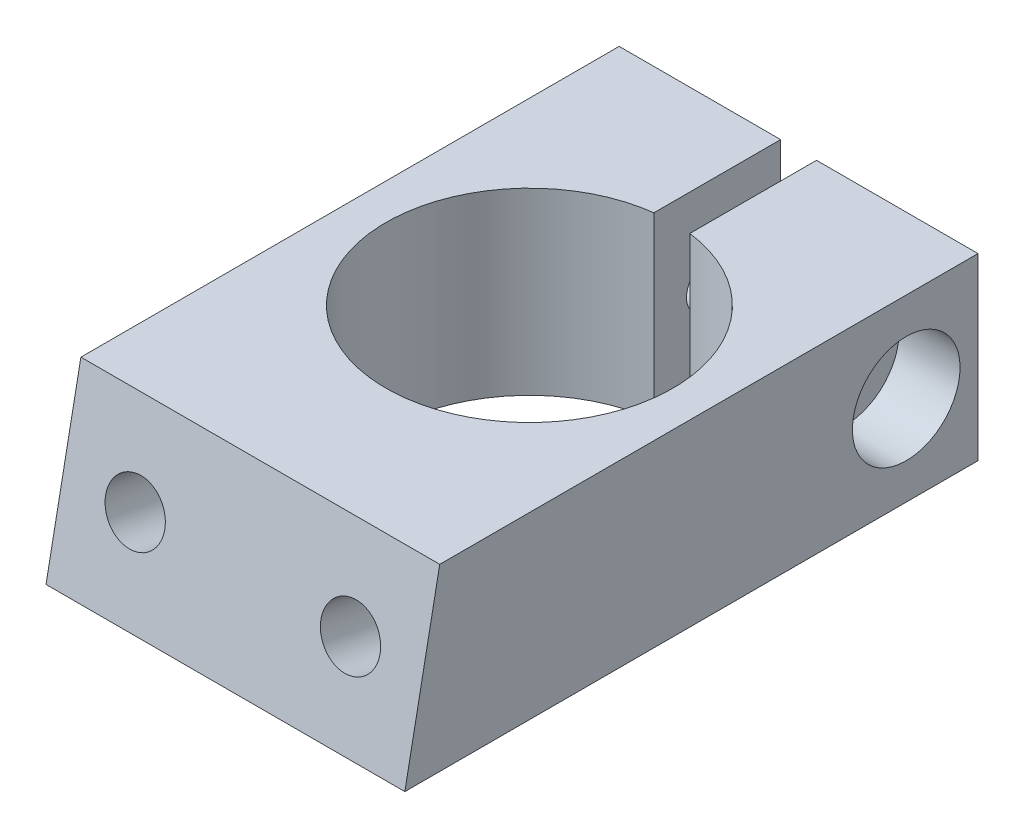
ISO-10303-21;
HEADER;
FILE_DESCRIPTION(('STEP AP214'),'2;1');
FILE_NAME('part.step','',(''),(''),'','','');
FILE_SCHEMA(('AUTOMOTIVE_DESIGN { 1 0 10303 214 1 1 1 1 }'));
ENDSEC;
DATA;
#1=APPLICATION_CONTEXT('core data for automotive mechanical design processes');
#2=APPLICATION_PROTOCOL_DEFINITION('international standard','automotive_design',2000,#1);
#3=PRODUCT_CONTEXT('',#1,'mechanical');
#4=PRODUCT('Part','Part','',(#3));
#5=PRODUCT_RELATED_PRODUCT_CATEGORY('part','',(#4));
#6=PRODUCT_DEFINITION_FORMATION('','',#4);
#7=PRODUCT_DEFINITION_CONTEXT('part definition',#1,'design');
#8=PRODUCT_DEFINITION('design','',#6,#7);
#9=PRODUCT_DEFINITION_SHAPE('','',#8);
#10=(LENGTH_UNIT() NAMED_UNIT(*) SI_UNIT(.MILLI.,.METRE.));
#11=(NAMED_UNIT(*) PLANE_ANGLE_UNIT() SI_UNIT($,.RADIAN.));
#12=(NAMED_UNIT(*) SI_UNIT($,.STERADIAN.) SOLID_ANGLE_UNIT());
#13=UNCERTAINTY_MEASURE_WITH_UNIT(LENGTH_MEASURE(1.E-05),#10,'distance_accuracy_value','');
#14=(GEOMETRIC_REPRESENTATION_CONTEXT(3) GLOBAL_UNCERTAINTY_ASSIGNED_CONTEXT((#13)) GLOBAL_UNIT_ASSIGNED_CONTEXT((#10,
#11,#12)) REPRESENTATION_CONTEXT('',''));
#15=CARTESIAN_POINT('',(0.,0.,0.));
#16=DIRECTION('',(0.,0.,1.));
#17=DIRECTION('',(1.,0.,0.));
#18=AXIS2_PLACEMENT_3D('',#15,#16,#17);
#19=CARTESIAN_POINT('',(10.,0.,-31.9438030913771));
#20=DIRECTION('',(0.,0.,1.));
#21=DIRECTION('',(1.,0.,0.));
#22=AXIS2_PLACEMENT_3D('',#19,#20,#21);
#23=PLANE('',#22);
#24=DIRECTION('',(-1.,0.,0.));
#25=VECTOR('',#24,1.);
#26=CARTESIAN_POINT('',(10.,10.,-31.9438030913771));
#27=LINE('',#26,#25);
#28=CARTESIAN_POINT('',(-1.,10.,-31.9438030913771));
#29=VERTEX_POINT('',#28);
#30=CARTESIAN_POINT('',(-10.,10.,-31.9438030913771));
#31=VERTEX_POINT('',#30);
#32=EDGE_CURVE('E251',#29,#31,#27,.T.);
#33=ORIENTED_EDGE('',*,*,#32,.F.);
#34=DIRECTION('',(0.,1.,0.));
#35=VECTOR('',#34,1.);
#36=CARTESIAN_POINT('',(-1.,0.,-31.9438030913771));
#37=LINE('',#36,#35);
#38=CARTESIAN_POINT('',(-1.,0.,-31.9438030913771));
#39=VERTEX_POINT('',#38);
#40=EDGE_CURVE('E226',#39,#29,#37,.T.);
#41=ORIENTED_EDGE('',*,*,#40,.F.);
#42=DIRECTION('',(-1.,0.,0.));
#43=VECTOR('',#42,1.);
#44=CARTESIAN_POINT('',(10.,0.,-31.9438030913771));
#45=LINE('',#44,#43);
#46=CARTESIAN_POINT('',(-10.,0.,-31.9438030913771));
#47=VERTEX_POINT('',#46);
#48=EDGE_CURVE('E167',#39,#47,#45,.T.);
#49=ORIENTED_EDGE('',*,*,#48,.T.);
#50=DIRECTION('',(0.,1.,0.));
#51=VECTOR('',#50,1.);
#52=CARTESIAN_POINT('',(-10.,0.,-31.9438030913771));
#53=LINE('',#52,#51);
#54=EDGE_CURVE('E242',#47,#31,#53,.T.);
#55=ORIENTED_EDGE('',*,*,#54,.T.);
#56=EDGE_LOOP('',(#33,#41,#49,#55));
#57=FACE_BOUND('',#56,.T.);
#58=ADVANCED_FACE('F39',(#57),#23,.F.);
#59=CARTESIAN_POINT('',(10.,0.,0.));
#60=DIRECTION('',(0.,1.,0.));
#61=DIRECTION('',(0.,0.,1.));
#62=AXIS2_PLACEMENT_3D('',#59,#60,#61);
#63=PLANE('',#62);
#64=ORIENTED_EDGE('',*,*,#48,.F.);
#65=DIRECTION('',(0.,0.,1.));
#66=VECTOR('',#65,1.);
#67=CARTESIAN_POINT('',(-1.,0.,-31.9438030913771));
#68=LINE('',#67,#66);
#69=CARTESIAN_POINT('',(-1.,0.,-24.8810570245709));
#70=VERTEX_POINT('',#69);
#71=EDGE_CURVE('E230',#39,#70,#68,.T.);
#72=ORIENTED_EDGE('',*,*,#71,.T.);
#73=CARTESIAN_POINT('',(0.,0.,-16.9438030913771));
#74=DIRECTION('',(0.,1.,0.));
#75=DIRECTION('',(0.,0.,1.));
#76=AXIS2_PLACEMENT_3D('',#73,#74,#75);
#77=CIRCLE('',#76,8.);
#78=CARTESIAN_POINT('',(1.,0.,-24.8810570245709));
#79=VERTEX_POINT('',#78);
#80=EDGE_CURVE('E218',#70,#79,#77,.T.);
#81=ORIENTED_EDGE('',*,*,#80,.T.);
#82=DIRECTION('',(0.,0.,-1.));
#83=VECTOR('',#82,1.);
#84=CARTESIAN_POINT('',(1.,0.,-31.9438030913771));
#85=LINE('',#84,#83);
#86=CARTESIAN_POINT('',(1.,0.,-31.9438030913771));
#87=VERTEX_POINT('',#86);
#88=EDGE_CURVE('E272',#79,#87,#85,.T.);
#89=ORIENTED_EDGE('',*,*,#88,.T.);
#90=CARTESIAN_POINT('',(10.,0.,-31.9438030913771));
#91=VERTEX_POINT('',#90);
#92=EDGE_CURVE('E158',#91,#87,#45,.T.);
#93=ORIENTED_EDGE('',*,*,#92,.F.);
#94=DIRECTION('',(0.,0.,-1.));
#95=VECTOR('',#94,1.);
#96=CARTESIAN_POINT('',(10.,0.,0.));
#97=LINE('',#96,#95);
#98=CARTESIAN_POINT('',(10.,0.,0.));
#99=VERTEX_POINT('',#98);
#100=EDGE_CURVE('E231',#99,#91,#97,.T.);
#101=ORIENTED_EDGE('',*,*,#100,.F.);
#102=DIRECTION('',(-1.,0.,0.));
#103=VECTOR('',#102,1.);
#104=CARTESIAN_POINT('',(10.,0.,0.));
#105=LINE('',#104,#103);
#106=CARTESIAN_POINT('',(-10.,0.,0.));
#107=VERTEX_POINT('',#106);
#108=EDGE_CURVE('E239',#99,#107,#105,.T.);
#109=ORIENTED_EDGE('',*,*,#108,.T.);
#110=DIRECTION('',(0.,0.,-1.));
#111=VECTOR('',#110,1.);
#112=CARTESIAN_POINT('',(-10.,0.,0.));
#113=LINE('',#112,#111);
#114=EDGE_CURVE('E225',#107,#47,#113,.T.);
#115=ORIENTED_EDGE('',*,*,#114,.T.);
#116=EDGE_LOOP('',(#64,#72,#81,#89,#93,#101,#109,#115));
#117=FACE_BOUND('',#116,.T.);
#118=ADVANCED_FACE('F41',(#117),#63,.F.);
#119=ORIENTED_EDGE('',*,*,#92,.T.);
#120=DIRECTION('',(0.,1.,0.));
#121=VECTOR('',#120,1.);
#122=CARTESIAN_POINT('',(1.,0.,-31.9438030913771));
#123=LINE('',#122,#121);
#124=CARTESIAN_POINT('',(1.,10.,-31.9438030913771));
#125=VERTEX_POINT('',#124);
#126=EDGE_CURVE('E160',#87,#125,#123,.T.);
#127=ORIENTED_EDGE('',*,*,#126,.T.);
#128=CARTESIAN_POINT('',(10.,10.,-31.9438030913771));
#129=VERTEX_POINT('',#128);
#130=EDGE_CURVE('E172',#129,#125,#27,.T.);
#131=ORIENTED_EDGE('',*,*,#130,.F.);
#132=DIRECTION('',(0.,1.,0.));
#133=VECTOR('',#132,1.);
#134=CARTESIAN_POINT('',(10.,0.,-31.9438030913771));
#135=LINE('',#134,#133);
#136=EDGE_CURVE('E162',#91,#129,#135,.T.);
#137=ORIENTED_EDGE('',*,*,#136,.F.);
#138=EDGE_LOOP('',(#119,#127,#131,#137));
#139=FACE_BOUND('',#138,.T.);
#140=ADVANCED_FACE('F140',(#139),#23,.F.);
#141=CARTESIAN_POINT('',(10.,10.,-1.94380309137715));
#142=DIRECTION('',(0.,-1.,0.));
#143=DIRECTION('',(0.,0.,-1.));
#144=AXIS2_PLACEMENT_3D('',#141,#142,#143);
#145=PLANE('',#144);
#146=CARTESIAN_POINT('',(0.,10.,-16.9438030913771));
#147=DIRECTION('',(0.,1.,0.));
#148=DIRECTION('',(0.,0.,1.));
#149=AXIS2_PLACEMENT_3D('',#146,#147,#148);
#150=CIRCLE('',#149,8.);
#151=CARTESIAN_POINT('',(-1.,10.,-24.8810570245709));
#152=VERTEX_POINT('',#151);
#153=CARTESIAN_POINT('',(0.999999999999999,10.,-24.8810570245709));
#154=VERTEX_POINT('',#153);
#155=EDGE_CURVE('E215',#152,#154,#150,.T.);
#156=ORIENTED_EDGE('',*,*,#155,.F.);
#157=DIRECTION('',(0.,0.,1.));
#158=VECTOR('',#157,1.);
#159=CARTESIAN_POINT('',(-1.,10.,-31.9438030913771));
#160=LINE('',#159,#158);
#161=EDGE_CURVE('E214',#29,#152,#160,.T.);
#162=ORIENTED_EDGE('',*,*,#161,.F.);
#163=ORIENTED_EDGE('',*,*,#32,.T.);
#164=DIRECTION('',(0.,0.,1.));
#165=VECTOR('',#164,1.);
#166=CARTESIAN_POINT('',(-10.,10.,-1.94380309137715));
#167=LINE('',#166,#165);
#168=CARTESIAN_POINT('',(-10.,10.,-1.94380309137715));
#169=VERTEX_POINT('',#168);
#170=EDGE_CURVE('E245',#31,#169,#167,.T.);
#171=ORIENTED_EDGE('',*,*,#170,.T.);
#172=DIRECTION('',(-1.,0.,0.));
#173=VECTOR('',#172,1.);
#174=CARTESIAN_POINT('',(10.,10.,-1.94380309137715));
#175=LINE('',#174,#173);
#176=CARTESIAN_POINT('',(10.,10.,-1.94380309137715));
#177=VERTEX_POINT('',#176);
#178=EDGE_CURVE('E249',#177,#169,#175,.T.);
#179=ORIENTED_EDGE('',*,*,#178,.F.);
#180=DIRECTION('',(0.,0.,1.));
#181=VECTOR('',#180,1.);
#182=CARTESIAN_POINT('',(10.,10.,-1.94380309137715));
#183=LINE('',#182,#181);
#184=EDGE_CURVE('E235',#129,#177,#183,.T.);
#185=ORIENTED_EDGE('',*,*,#184,.F.);
#186=ORIENTED_EDGE('',*,*,#130,.T.);
#187=DIRECTION('',(0.,0.,-1.));
#188=VECTOR('',#187,1.);
#189=CARTESIAN_POINT('',(1.,10.,-31.9438030913771));
#190=LINE('',#189,#188);
#191=EDGE_CURVE('E210',#154,#125,#190,.T.);
#192=ORIENTED_EDGE('',*,*,#191,.F.);
#193=EDGE_LOOP('',(#156,#162,#163,#171,#179,#185,#186,#192));
#194=FACE_BOUND('',#193,.T.);
#195=ADVANCED_FACE('F148',(#194),#145,.F.);
#196=CARTESIAN_POINT('',(10.,0.,0.));
#197=DIRECTION('',(0.,-0.190808995376542,-0.981627183447665));
#198=DIRECTION('',(0.,0.981627183447665,-0.190808995376542));
#199=AXIS2_PLACEMENT_3D('',#196,#197,#198);
#200=PLANE('',#199);
#201=CARTESIAN_POINT('',(-6.,5.,-0.971901545688574));
#202=DIRECTION('',(0.,0.190808995376542,0.981627183447665));
#203=DIRECTION('',(0.,-0.981627183447665,0.190808995376542));
#204=AXIS2_PLACEMENT_3D('',#201,#202,#203);
#205=CIRCLE('',#204,1.64999999999999);
#206=CARTESIAN_POINT('',(-6.,3.38031514731136,-0.657066703317282));
#207=VERTEX_POINT('',#206);
#208=EDGE_CURVE('E281',#207,#207,#205,.T.);
#209=ORIENTED_EDGE('',*,*,#208,.F.);
#210=EDGE_LOOP('',(#209));
#211=FACE_BOUND('',#210,.T.);
#212=CARTESIAN_POINT('',(6.,5.,-0.971901545688574));
#213=DIRECTION('',(0.,0.190808995376542,0.981627183447665));
#214=DIRECTION('',(0.,-0.981627183447665,0.190808995376542));
#215=AXIS2_PLACEMENT_3D('',#212,#213,#214);
#216=CIRCLE('',#215,1.64999999999999);
#217=CARTESIAN_POINT('',(6.,3.38031514731136,-0.657066703317282));
#218=VERTEX_POINT('',#217);
#219=EDGE_CURVE('E277',#218,#218,#216,.T.);
#220=ORIENTED_EDGE('',*,*,#219,.F.);
#221=EDGE_LOOP('',(#220));
#222=FACE_BOUND('',#221,.T.);
#223=DIRECTION('',(0.,-0.981627183447665,0.190808995376542));
#224=VECTOR('',#223,1.);
#225=CARTESIAN_POINT('',(-10.,0.,0.));
#226=LINE('',#225,#224);
#227=EDGE_CURVE('E233',#169,#107,#226,.T.);
#228=ORIENTED_EDGE('',*,*,#227,.T.);
#229=ORIENTED_EDGE('',*,*,#108,.F.);
#230=DIRECTION('',(0.,-0.981627183447665,0.190808995376542));
#231=VECTOR('',#230,1.);
#232=CARTESIAN_POINT('',(10.,0.,0.));
#233=LINE('',#232,#231);
#234=EDGE_CURVE('E237',#177,#99,#233,.T.);
#235=ORIENTED_EDGE('',*,*,#234,.F.);
#236=ORIENTED_EDGE('',*,*,#178,.T.);
#237=EDGE_LOOP('',(#228,#229,#235,#236));
#238=FACE_BOUND('',#237,.T.);
#239=ADVANCED_FACE('F153',(#211,#222,#238),#200,.F.);
#240=CARTESIAN_POINT('',(10.,0.,0.));
#241=DIRECTION('',(1.,0.,0.));
#242=DIRECTION('',(0.,0.,-1.));
#243=AXIS2_PLACEMENT_3D('',#240,#241,#242);
#244=PLANE('',#243);
#245=CARTESIAN_POINT('',(10.,5.,-27.9438030913771));
#246=DIRECTION('',(1.,0.,0.));
#247=DIRECTION('',(0.,0.,-1.));
#248=AXIS2_PLACEMENT_3D('',#245,#246,#247);
#249=CIRCLE('',#248,3.);
#250=CARTESIAN_POINT('',(10.,5.,-30.9438030913771));
#251=VERTEX_POINT('',#250);
#252=EDGE_CURVE('E290',#251,#251,#249,.T.);
#253=ORIENTED_EDGE('',*,*,#252,.F.);
#254=EDGE_LOOP('',(#253));
#255=FACE_BOUND('',#254,.T.);
#256=ORIENTED_EDGE('',*,*,#100,.T.);
#257=ORIENTED_EDGE('',*,*,#136,.T.);
#258=ORIENTED_EDGE('',*,*,#184,.T.);
#259=ORIENTED_EDGE('',*,*,#234,.T.);
#260=EDGE_LOOP('',(#256,#257,#258,#259));
#261=FACE_BOUND('',#260,.T.);
#262=ADVANCED_FACE('F259',(#255,#261),#244,.T.);
#263=CARTESIAN_POINT('',(-10.,0.,0.));
#264=DIRECTION('',(1.,0.,0.));
#265=DIRECTION('',(0.,0.,-1.));
#266=AXIS2_PLACEMENT_3D('',#263,#264,#265);
#267=PLANE('',#266);
#268=CARTESIAN_POINT('',(-10.,5.,-27.9438030913771));
#269=DIRECTION('',(-1.,0.,0.));
#270=DIRECTION('',(0.,0.,1.));
#271=AXIS2_PLACEMENT_3D('',#268,#269,#270);
#272=CIRCLE('',#271,1.24999999999999);
#273=CARTESIAN_POINT('',(-10.,5.,-26.6938030913772));
#274=VERTEX_POINT('',#273);
#275=EDGE_CURVE('E296',#274,#274,#272,.T.);
#276=ORIENTED_EDGE('',*,*,#275,.F.);
#277=EDGE_LOOP('',(#276));
#278=FACE_BOUND('',#277,.T.);
#279=ORIENTED_EDGE('',*,*,#114,.F.);
#280=ORIENTED_EDGE('',*,*,#227,.F.);
#281=ORIENTED_EDGE('',*,*,#170,.F.);
#282=ORIENTED_EDGE('',*,*,#54,.F.);
#283=EDGE_LOOP('',(#279,#280,#281,#282));
#284=FACE_BOUND('',#283,.T.);
#285=ADVANCED_FACE('F265',(#278,#284),#267,.F.);
#286=CARTESIAN_POINT('',(0.,0.,-16.9438030913771));
#287=DIRECTION('',(0.,1.,0.));
#288=DIRECTION('',(0.,0.,1.));
#289=AXIS2_PLACEMENT_3D('',#286,#287,#288);
#290=CYLINDRICAL_SURFACE('',#289,8.);
#291=CARTESIAN_POINT('',(-4.3497999999999,4.78555314320758,-10.2296955587261));
#292=CARTESIAN_POINT('',(-4.40750052002957,4.71800100547957,-10.2670851176018));
#293=CARTESIAN_POINT('',(-4.46285348559482,4.64824454828552,-10.3039957739027));
#294=CARTESIAN_POINT('',(-4.56939997843601,4.50428899256489,-10.376854636985));
#295=CARTESIAN_POINT('',(-4.62056298255942,4.43006313807976,-10.4127946878358));
#296=CARTESIAN_POINT('',(-4.72498576467966,4.26797803449677,-10.4878652441221));
#297=CARTESIAN_POINT('',(-4.77762389938027,4.17961613944503,-10.5267868295242));
#298=CARTESIAN_POINT('',(-4.8513339226776,4.04335894776263,-10.5825522012365));
#299=CARTESIAN_POINT('',(-4.87500056353487,3.99738631274766,-10.6006814456993));
#300=CARTESIAN_POINT('',(-4.92014208162298,3.90390420171696,-10.6356330807807));
#301=CARTESIAN_POINT('',(-4.94161855519919,3.85639587876447,-10.6524564210653));
#302=CARTESIAN_POINT('',(-4.9713979395522,3.78364454543217,-10.6759992936631));
#303=CARTESIAN_POINT('',(-4.98091036991524,3.75917070059651,-10.6835583049683));
#304=CARTESIAN_POINT('',(-4.99888841454552,3.70958110626856,-10.6979047376051));
#305=CARTESIAN_POINT('',(-5.00735299143455,3.68446474989746,-10.7046913937749));
#306=CARTESIAN_POINT('',(-5.022721516625,3.63387606073338,-10.7170572017405));
#307=CARTESIAN_POINT('',(-5.02964632877367,3.60841418219741,-10.7226524465292));
#308=CARTESIAN_POINT('',(-5.04145866083426,3.55674164565586,-10.7322209599216));
#309=CARTESIAN_POINT('',(-5.04635066965838,3.53053277553514,-10.7361978019371));
#310=CARTESIAN_POINT('',(-5.05232898422522,3.48355899138644,-10.7410630978465));
#311=CARTESIAN_POINT('',(-5.05403264918611,3.46293197901775,-10.7424521817915));
#312=CARTESIAN_POINT('',(-5.05501070015156,3.42159018131398,-10.7432492055595));
#313=CARTESIAN_POINT('',(-5.05429170425604,3.40087578923622,-10.7426625426281));
#314=CARTESIAN_POINT('',(-5.05019238511579,3.36309549353235,-10.7393238794799));
#315=CARTESIAN_POINT('',(-5.04723595201793,3.34595615872554,-10.7369168082195));
#316=CARTESIAN_POINT('',(-5.03904767225764,3.31258799688234,-10.7302673742542));
#317=CARTESIAN_POINT('',(-5.03381501755525,3.29635949549624,-10.7260243598076));
#318=CARTESIAN_POINT('',(-5.02131657058956,3.26534184765404,-10.7159268078207));
#319=CARTESIAN_POINT('',(-5.0140589349939,3.25054724106699,-10.7100787369944));
#320=CARTESIAN_POINT('',(-4.99791635716767,3.22248451444324,-10.6971287841571));
#321=CARTESIAN_POINT('',(-4.98903002939938,3.20921770988353,-10.6900258348007));
#322=CARTESIAN_POINT('',(-4.96272185135483,3.174454406329,-10.6691041190859));
#323=CARTESIAN_POINT('',(-4.94401050180949,3.15452039860062,-10.654337113927));
#324=CARTESIAN_POINT('',(-4.90438712177512,3.11822454830451,-10.6233894369783));
#325=CARTESIAN_POINT('',(-4.88346556539046,3.10187918734869,-10.6072027016264));
#326=CARTESIAN_POINT('',(-4.83885478243136,3.07097346796448,-10.5730634712127));
#327=CARTESIAN_POINT('',(-4.81507404088934,3.05659910200059,-10.5550646701488));
#328=CARTESIAN_POINT('',(-4.7664421651982,3.03031173358623,-10.5186994967889));
#329=CARTESIAN_POINT('',(-4.74158986328987,3.01840150282983,-10.5003327357928));
#330=CARTESIAN_POINT('',(-4.66580014388538,2.98571964409093,-10.445017904441));
#331=CARTESIAN_POINT('',(-4.61366270514313,2.96801761089603,-10.407880486181));
#332=CARTESIAN_POINT('',(-4.52603096329566,2.94437416252325,-10.3470753968572));
#333=CARTESIAN_POINT('',(-4.49112545842381,2.93648591948113,-10.3232597292052));
#334=CARTESIAN_POINT('',(-4.42084101787222,2.92347914059862,-10.2761240892378));
#335=CARTESIAN_POINT('',(-4.38546723169348,2.91834125925998,-10.2528017934174));
#336=CARTESIAN_POINT('',(-4.3498,2.91449428387203,-10.2296955587262));
#337=B_SPLINE_CURVE_WITH_KNOTS('',3,(#291,#292,#293,#294,#295,#296,#297,#298,#299,#300,#301,
#302,#303,#304,#305,#306,#307,#308,#309,#310,#311,#312,#313,#314,#315,#316,#317,#318,#319,#320,
#321,#322,#323,#324,#325,#326,#327,#328,#329,#330,#331,#332,#333,#334,#335,#336),.UNSPECIFIED.,
.F.,.F.,(4,2,2,2,2,2,2,2,2,2,2,2,2,2,2,2,2,2,2,2,2,2,4),(0.,0.289030910277062,0.58000835609287,
0.909571660746221,1.07390383335235,1.23811536013393,1.32006047288316,1.40208607355599,
1.48292140421074,1.56357727029212,1.62563892562685,1.6875311817343,1.73995658437163,
1.7924006128026,1.84463637170233,1.89691677587561,1.98959606998729,2.08269250009958,
2.18186180066952,2.28114204898956,2.47984018192443,2.60872410805144,2.73668916455364),.UNSPECIFIED.);
#338=CARTESIAN_POINT('',(-4.74272614292144,4.23621543440954,-10.501245467789));
#339=VERTEX_POINT('',#338);
#340=CARTESIAN_POINT('',(-4.37310804893606,2.91719296688695,-10.2448534727928));
#341=VERTEX_POINT('',#340);
#342=EDGE_CURVE('E48',#339,#341,#337,.T.);
#343=ORIENTED_EDGE('',*,*,#342,.T.);
#344=CARTESIAN_POINT('',(-4.37310804893575,2.91719296688884,-10.2448534727927));
#345=CARTESIAN_POINT('',(-4.36681540877265,2.95588874912051,-10.2407470241928));
#346=CARTESIAN_POINT('',(-4.36176466008344,2.99486157231184,-10.2374608639397));
#347=CARTESIAN_POINT('',(-4.35425306822788,3.07317750831471,-10.2325808987111));
#348=CARTESIAN_POINT('',(-4.35179338143847,3.11252077855858,-10.230987849359));
#349=CARTESIAN_POINT('',(-4.34846502940366,3.23085070507415,-10.2288292137294));
#350=CARTESIAN_POINT('',(-4.3516590871861,3.31006534078771,-10.2308919158558));
#351=CARTESIAN_POINT('',(-4.36934970807,3.46690173084845,-10.2423933529971));
#352=CARTESIAN_POINT('',(-4.38387822559437,3.54451834402017,-10.2518529416931));
#353=CARTESIAN_POINT('',(-4.42405700764605,3.69541122369526,-10.2783479189587));
#354=CARTESIAN_POINT('',(-4.44969570200681,3.76869191565067,-10.29537542675));
#355=CARTESIAN_POINT('',(-4.50974667860161,3.90540689236073,-10.3359720195412));
#356=CARTESIAN_POINT('',(-4.5437140183183,3.96913534554938,-10.3592135551903));
#357=CARTESIAN_POINT('',(-4.61946734554988,4.0886750368571,-10.4121390693902));
#358=CARTESIAN_POINT('',(-4.66124179537145,4.14449774714501,-10.4418135512696));
#359=CARTESIAN_POINT('',(-4.71801478080315,4.20959482820847,-10.4831094220796));
#360=CARTESIAN_POINT('',(-4.7302728278647,4.22307570995386,-10.4920773498898));
#361=CARTESIAN_POINT('',(-4.74272614292063,4.23621543440861,-10.5012454677887));
#362=B_SPLINE_CURVE_WITH_KNOTS('',3,(#344,#345,#346,#347,#348,#349,#350,#351,#352,#353,#354,
#355,#356,#357,#358,#359,#360,#361),.UNSPECIFIED.,.F.,.F.,(4,2,2,2,2,2,2,2,4),(0.,
0.11819914228632,0.236451013891966,0.473172834631664,0.710564450447648,0.947709437926062,
1.1742211649497,1.40040075270548,1.46130213378244),.UNSPECIFIED.);
#363=EDGE_CURVE('E11',#341,#339,#362,.T.);
#364=ORIENTED_EDGE('',*,*,#363,.T.);
#365=EDGE_LOOP('',(#343,#364));
#366=FACE_BOUND('',#365,.T.);
#367=CARTESIAN_POINT('',(4.3498,2.91449428387203,-10.2296955587262));
#368=CARTESIAN_POINT('',(4.39118574276836,2.91898046622519,-10.2565023893941));
#369=CARTESIAN_POINT('',(4.43220748404786,2.9251754183177,-10.2836270395121));
#370=CARTESIAN_POINT('',(4.51354833067856,2.94126672222755,-10.3384805567497));
#371=CARTESIAN_POINT('',(4.55386014233714,2.95118970417986,-10.3662123857167));
#372=CARTESIAN_POINT('',(4.63540312106374,2.97562382926634,-10.4233997296413));
#373=CARTESIAN_POINT('',(4.67656061435958,2.9903595663642,-10.4528652869419));
#374=CARTESIAN_POINT('',(4.75680032156518,3.02496073475308,-10.5114401720308));
#375=CARTESIAN_POINT('',(4.79588914477832,3.04480846983771,-10.5405503729));
#376=CARTESIAN_POINT('',(4.85709088168455,3.08298771713363,-10.5869514082819));
#377=CARTESIAN_POINT('',(4.88018039327344,3.09921499358245,-10.604668316534));
#378=CARTESIAN_POINT('',(4.92415137001318,3.13533920182826,-10.6387661303073));
#379=CARTESIAN_POINT('',(4.94504903878748,3.15520570154188,-10.6551565996886));
#380=CARTESIAN_POINT('',(4.97543425729027,3.19077189085113,-10.6791988670468));
#381=CARTESIAN_POINT('',(4.98610238196764,3.2048730385065,-10.6876908705465));
#382=CARTESIAN_POINT('',(5.00560564415517,3.23499348351493,-10.7032849367849));
#383=CARTESIAN_POINT('',(5.01444332882,3.25101006577668,-10.7103889302223));
#384=CARTESIAN_POINT('',(5.02976598745446,3.28506294912321,-10.7227457959393));
#385=CARTESIAN_POINT('',(5.03622343875268,3.3031199034134,-10.7279769943234));
#386=CARTESIAN_POINT('',(5.04623396748502,3.34050677709803,-10.736100997524));
#387=CARTESIAN_POINT('',(5.04978816446884,3.35983620269339,-10.7389947037167));
#388=CARTESIAN_POINT('',(5.05438952796011,3.40127984582122,-10.7427421697071));
#389=CARTESIAN_POINT('',(5.05509210863673,3.42345391402113,-10.7433155199025));
#390=CARTESIAN_POINT('',(5.05377309138668,3.46768341074227,-10.7422406566439));
#391=CARTESIAN_POINT('',(5.05174205272258,3.48973816264617,-10.7405847442776));
#392=CARTESIAN_POINT('',(5.04512318667825,3.53757456134766,-10.7351999479765));
#393=CARTESIAN_POINT('',(5.04011766886127,3.56325429345759,-10.7311327551237));
#394=CARTESIAN_POINT('',(5.02820578089283,3.61389479867909,-10.721487986925));
#395=CARTESIAN_POINT('',(5.02129580413667,3.63885410739866,-10.7159075461639));
#396=CARTESIAN_POINT('',(5.00605104373422,3.68840458762424,-10.7036468558194));
#397=CARTESIAN_POINT('',(4.99769960576124,3.71298731769247,-10.6969537889187));
#398=CARTESIAN_POINT('',(4.97999913652112,3.76154203332952,-10.6828337259466));
#399=CARTESIAN_POINT('',(4.97065096103879,3.78551452128031,-10.6754073598742));
#400=CARTESIAN_POINT('',(4.9411413534618,3.85746454913977,-10.6520820772018));
#401=CARTESIAN_POINT('',(4.91977887932769,3.90467739750462,-10.6353505308957));
#402=CARTESIAN_POINT('',(4.87489327520392,3.99758756147635,-10.6005997366891));
#403=CARTESIAN_POINT('',(4.85136860137357,4.04328376198748,-10.5825795707662));
#404=CARTESIAN_POINT('',(4.77811790722692,4.17872539827987,-10.5271583259041));
#405=CARTESIAN_POINT('',(4.72582700640379,4.26657022251716,-10.4884858096955));
#406=CARTESIAN_POINT('',(4.62161982126263,4.4285109311562,-10.4135405735057));
#407=CARTESIAN_POINT('',(4.57027314942268,4.50306700724358,-10.3774598335361));
#408=CARTESIAN_POINT('',(4.4633191726566,4.64765575091054,-10.3043063379001));
#409=CARTESIAN_POINT('',(4.40774226692028,4.71771505566716,-10.2672417138075));
#410=CARTESIAN_POINT('',(4.3497999999999,4.78555314320758,-10.2296955587261));
#411=B_SPLINE_CURVE_WITH_KNOTS('',3,(#367,#368,#369,#370,#371,#372,#373,#374,#375,#376,#377,
#378,#379,#380,#381,#382,#383,#384,#385,#386,#387,#388,#389,#390,#391,#392,#393,#394,#395,#396,
#397,#398,#399,#400,#401,#402,#403,#404,#405,#406,#407,#408,#409,#410),.UNSPECIFIED.,.F.,.F.,(4,
2,2,2,2,2,2,2,2,2,2,2,2,2,2,2,2,2,2,2,2,4),(0.,0.148541062347292,0.298164008236407,
0.456113191896757,0.613522784337119,0.713315020986379,0.812307997996541,0.870981426252823,
0.92957265046371,0.988821559789838,1.04804761081719,1.11424936819667,1.18068034542134,
1.25992816880529,1.33932711284417,1.41971372098474,1.50003185777192,1.66325921099665,
1.82660402988438,2.1541643264536,2.44634361212128,2.73659200908002),.UNSPECIFIED.);
#412=CARTESIAN_POINT('',(4.3731080489358,2.91719296688853,-10.2448534727927));
#413=VERTEX_POINT('',#412);
#414=CARTESIAN_POINT('',(4.74272614292142,4.23621543440947,-10.5012454677892));
#415=VERTEX_POINT('',#414);
#416=EDGE_CURVE('E166',#413,#415,#411,.T.);
#417=ORIENTED_EDGE('',*,*,#416,.T.);
#418=CARTESIAN_POINT('',(4.74272614292066,4.23621543440863,-10.5012454677888));
#419=CARTESIAN_POINT('',(4.71947869540742,4.21167878116421,-10.4841310112803));
#420=CARTESIAN_POINT('',(4.69693457973272,4.18599694979054,-10.4677298181899));
#421=CARTESIAN_POINT('',(4.65346350213578,4.13243493192525,-10.4364232138683));
#422=CARTESIAN_POINT('',(4.63253693733754,4.10455420895795,-10.4215181696893));
#423=CARTESIAN_POINT('',(4.57260228282155,4.01789528788366,-10.3792240862041));
#424=CARTESIAN_POINT('',(4.53633721477785,3.95599374261302,-10.3541817328505));
#425=CARTESIAN_POINT('',(4.47273794916986,3.82547358910053,-10.3108466096123));
#426=CARTESIAN_POINT('',(4.4454200869187,3.75684298878091,-10.2925661774858));
#427=CARTESIAN_POINT('',(4.40079322373675,3.61499309640785,-10.2629542696712));
#428=CARTESIAN_POINT('',(4.3834831380003,3.54177430265149,-10.2516220408157));
#429=CARTESIAN_POINT('',(4.3593874255967,3.39381169006846,-10.2359015157412));
#430=CARTESIAN_POINT('',(4.35248272312499,3.31909519807808,-10.2314346426892));
#431=CARTESIAN_POINT('',(4.3486410580348,3.16937345407452,-10.2289437943804));
#432=CARTESIAN_POINT('',(4.35169561095817,3.09436850219468,-10.2309143349848));
#433=CARTESIAN_POINT('',(4.36297645153781,2.98561004745231,-10.2382506559079));
#434=CARTESIAN_POINT('',(4.36755716584965,2.95127568885019,-10.241233091984));
#435=CARTESIAN_POINT('',(4.37310804893575,2.91719296688875,-10.2448534727926));
#436=B_SPLINE_CURVE_WITH_KNOTS('',3,(#418,#419,#420,#421,#422,#423,#424,#425,#426,#427,#428,
#429,#430,#431,#432,#433,#434,#435),.UNSPECIFIED.,.F.,.F.,(4,2,2,2,2,2,2,2,4),(0.,
0.113601783593175,0.227231369490047,0.454001032228529,0.681182439996574,0.908339217527749,
1.13287620415139,1.3572219539151,1.4614256380987),.UNSPECIFIED.);
#437=EDGE_CURVE('E170',#415,#413,#436,.T.);
#438=ORIENTED_EDGE('',*,*,#437,.T.);
#439=EDGE_LOOP('',(#417,#438));
#440=FACE_BOUND('',#439,.T.);
#441=ORIENTED_EDGE('',*,*,#155,.T.);
#442=DIRECTION('',(0.,1.,0.));
#443=VECTOR('',#442,1.);
#444=CARTESIAN_POINT('',(1.,0.,-24.8810570245709));
#445=LINE('',#444,#443);
#446=EDGE_CURVE('E212',#79,#154,#445,.T.);
#447=ORIENTED_EDGE('',*,*,#446,.F.);
#448=ORIENTED_EDGE('',*,*,#80,.F.);
#449=DIRECTION('',(0.,1.,0.));
#450=VECTOR('',#449,1.);
#451=CARTESIAN_POINT('',(-1.,0.,-24.8810570245709));
#452=LINE('',#451,#450);
#453=EDGE_CURVE('E223',#70,#152,#452,.T.);
#454=ORIENTED_EDGE('',*,*,#453,.T.);
#455=EDGE_LOOP('',(#441,#447,#448,#454));
#456=FACE_BOUND('',#455,.T.);
#457=ADVANCED_FACE('F185',(#366,#440,#456),#290,.F.);
#458=CARTESIAN_POINT('',(-1.,0.,-31.9438030913771));
#459=DIRECTION('',(-1.,0.,0.));
#460=DIRECTION('',(0.,0.,1.));
#461=AXIS2_PLACEMENT_3D('',#458,#459,#460);
#462=PLANE('',#461);
#463=CARTESIAN_POINT('',(-0.999999999999999,5.,-27.9438030913771));
#464=DIRECTION('',(-1.,0.,0.));
#465=DIRECTION('',(0.,0.,1.));
#466=AXIS2_PLACEMENT_3D('',#463,#464,#465);
#467=CIRCLE('',#466,1.24999999999999);
#468=CARTESIAN_POINT('',(-0.999999999999999,5.,-26.6938030913772));
#469=VERTEX_POINT('',#468);
#470=EDGE_CURVE('E293',#469,#469,#467,.T.);
#471=ORIENTED_EDGE('',*,*,#470,.T.);
#472=EDGE_LOOP('',(#471));
#473=FACE_BOUND('',#472,.T.);
#474=ORIENTED_EDGE('',*,*,#161,.T.);
#475=ORIENTED_EDGE('',*,*,#453,.F.);
#476=ORIENTED_EDGE('',*,*,#71,.F.);
#477=ORIENTED_EDGE('',*,*,#40,.T.);
#478=EDGE_LOOP('',(#474,#475,#476,#477));
#479=FACE_BOUND('',#478,.T.);
#480=ADVANCED_FACE('F195',(#473,#479),#462,.F.);
#481=CARTESIAN_POINT('',(1.,0.,-31.9438030913771));
#482=DIRECTION('',(1.,0.,0.));
#483=DIRECTION('',(0.,0.,-1.));
#484=AXIS2_PLACEMENT_3D('',#481,#482,#483);
#485=PLANE('',#484);
#486=CARTESIAN_POINT('',(0.999999999999999,5.,-27.9438030913771));
#487=DIRECTION('',(1.,0.,0.));
#488=DIRECTION('',(0.,0.,-1.));
#489=AXIS2_PLACEMENT_3D('',#486,#487,#488);
#490=CIRCLE('',#489,1.6);
#491=CARTESIAN_POINT('',(0.999999999999999,5.,-29.5438030913771));
#492=VERTEX_POINT('',#491);
#493=EDGE_CURVE('E43',#492,#492,#490,.T.);
#494=ORIENTED_EDGE('',*,*,#493,.T.);
#495=EDGE_LOOP('',(#494));
#496=FACE_BOUND('',#495,.T.);
#497=ORIENTED_EDGE('',*,*,#191,.T.);
#498=ORIENTED_EDGE('',*,*,#126,.F.);
#499=ORIENTED_EDGE('',*,*,#88,.F.);
#500=ORIENTED_EDGE('',*,*,#446,.T.);
#501=EDGE_LOOP('',(#497,#498,#499,#500));
#502=FACE_BOUND('',#501,.T.);
#503=ADVANCED_FACE('F197',(#496,#502),#485,.F.);
#504=CARTESIAN_POINT('',(6.,5.,-0.971901545688576));
#505=DIRECTION('',(0.,0.190808995376542,0.981627183447665));
#506=DIRECTION('',(0.,-0.981627183447665,0.190808995376542));
#507=AXIS2_PLACEMENT_3D('',#504,#505,#506);
#508=CYLINDRICAL_SURFACE('',#507,1.64999999999999);
#509=ORIENTED_EDGE('',*,*,#219,.T.);
#510=EDGE_LOOP('',(#509));
#511=FACE_BOUND('',#510,.T.);
#512=CARTESIAN_POINT('',(6.,3.18731454392285,-10.2973597884414));
#513=DIRECTION('',(0.,0.190808995376542,0.981627183447665));
#514=DIRECTION('',(0.,-0.981627183447665,0.190808995376542));
#515=AXIS2_PLACEMENT_3D('',#512,#513,#514);
#516=CIRCLE('',#515,1.65);
#517=EDGE_CURVE('E61',#413,#415,#516,.T.);
#518=ORIENTED_EDGE('',*,*,#517,.F.);
#519=ORIENTED_EDGE('',*,*,#437,.F.);
#520=EDGE_LOOP('',(#518,#519));
#521=FACE_BOUND('',#520,.T.);
#522=ADVANCED_FACE('F192',(#511,#521),#508,.F.);
#523=CARTESIAN_POINT('',(6.,3.18731454392285,-10.2973597884414));
#524=DIRECTION('',(0.,0.190808995376542,0.981627183447665));
#525=DIRECTION('',(0.,-0.981627183447665,0.190808995376542));
#526=AXIS2_PLACEMENT_3D('',#523,#524,#525);
#527=CONICAL_SURFACE('',#526,1.65,1.02974425867665);
#528=CARTESIAN_POINT('',(6.,2.99814268564419,-11.2705646316575));
#529=VERTEX_POINT('',#528);
#530=VERTEX_LOOP('',#529);
#531=FACE_BOUND('',#530,.T.);
#532=ORIENTED_EDGE('',*,*,#517,.T.);
#533=ORIENTED_EDGE('',*,*,#416,.F.);
#534=EDGE_LOOP('',(#532,#533));
#535=FACE_BOUND('',#534,.T.);
#536=ADVANCED_FACE('F133',(#531,#535),#527,.F.);
#537=CARTESIAN_POINT('',(-6.,5.,-0.971901545688576));
#538=DIRECTION('',(0.,0.190808995376542,0.981627183447665));
#539=DIRECTION('',(0.,-0.981627183447665,0.190808995376542));
#540=AXIS2_PLACEMENT_3D('',#537,#538,#539);
#541=CYLINDRICAL_SURFACE('',#540,1.64999999999999);
#542=ORIENTED_EDGE('',*,*,#208,.T.);
#543=EDGE_LOOP('',(#542));
#544=FACE_BOUND('',#543,.T.);
#545=CARTESIAN_POINT('',(-6.,3.18731454392285,-10.2973597884414));
#546=DIRECTION('',(0.,0.190808995376542,0.981627183447665));
#547=DIRECTION('',(0.,-0.981627183447665,0.190808995376542));
#548=AXIS2_PLACEMENT_3D('',#545,#546,#547);
#549=CIRCLE('',#548,1.65);
#550=EDGE_CURVE('E54',#339,#341,#549,.T.);
#551=ORIENTED_EDGE('',*,*,#550,.F.);
#552=ORIENTED_EDGE('',*,*,#363,.F.);
#553=EDGE_LOOP('',(#551,#552));
#554=FACE_BOUND('',#553,.T.);
#555=ADVANCED_FACE('F124',(#544,#554),#541,.F.);
#556=CARTESIAN_POINT('',(-6.,3.18731454392285,-10.2973597884414));
#557=DIRECTION('',(0.,0.190808995376542,0.981627183447665));
#558=DIRECTION('',(0.,-0.981627183447665,0.190808995376542));
#559=AXIS2_PLACEMENT_3D('',#556,#557,#558);
#560=CONICAL_SURFACE('',#559,1.65,1.02974425867665);
#561=CARTESIAN_POINT('',(-6.,2.99814268564419,-11.2705646316575));
#562=VERTEX_POINT('',#561);
#563=VERTEX_LOOP('',#562);
#564=FACE_BOUND('',#563,.T.);
#565=ORIENTED_EDGE('',*,*,#550,.T.);
#566=ORIENTED_EDGE('',*,*,#342,.F.);
#567=EDGE_LOOP('',(#565,#566));
#568=FACE_BOUND('',#567,.T.);
#569=ADVANCED_FACE('F121',(#564,#568),#560,.F.);
#570=CARTESIAN_POINT('',(10.,5.,-27.9438030913771));
#571=DIRECTION('',(1.,0.,0.));
#572=DIRECTION('',(0.,0.,-1.));
#573=AXIS2_PLACEMENT_3D('',#570,#571,#572);
#574=CYLINDRICAL_SURFACE('',#573,1.6);
#575=CARTESIAN_POINT('',(6.6,5.,-27.9438030913771));
#576=DIRECTION('',(1.,0.,0.));
#577=DIRECTION('',(0.,0.,-1.));
#578=AXIS2_PLACEMENT_3D('',#575,#576,#577);
#579=CIRCLE('',#578,1.6);
#580=CARTESIAN_POINT('',(6.6,5.,-29.5438030913771));
#581=VERTEX_POINT('',#580);
#582=EDGE_CURVE('E284',#581,#581,#579,.T.);
#583=ORIENTED_EDGE('',*,*,#582,.T.);
#584=EDGE_LOOP('',(#583));
#585=FACE_BOUND('',#584,.T.);
#586=ORIENTED_EDGE('',*,*,#493,.F.);
#587=EDGE_LOOP('',(#586));
#588=FACE_BOUND('',#587,.T.);
#589=ADVANCED_FACE('F123',(#585,#588),#574,.F.);
#590=CARTESIAN_POINT('',(6.6,6.6,-27.9438030913771));
#591=DIRECTION('',(-1.,0.,0.));
#592=DIRECTION('',(0.,0.,1.));
#593=AXIS2_PLACEMENT_3D('',#590,#591,#592);
#594=PLANE('',#593);
#595=ORIENTED_EDGE('',*,*,#582,.F.);
#596=EDGE_LOOP('',(#595));
#597=FACE_BOUND('',#596,.T.);
#598=CARTESIAN_POINT('',(6.6,5.,-27.9438030913771));
#599=DIRECTION('',(1.,0.,0.));
#600=DIRECTION('',(0.,0.,-1.));
#601=AXIS2_PLACEMENT_3D('',#598,#599,#600);
#602=CIRCLE('',#601,3.);
#603=CARTESIAN_POINT('',(6.6,5.,-30.9438030913771));
#604=VERTEX_POINT('',#603);
#605=EDGE_CURVE('E287',#604,#604,#602,.T.);
#606=ORIENTED_EDGE('',*,*,#605,.T.);
#607=EDGE_LOOP('',(#606));
#608=FACE_BOUND('',#607,.T.);
#609=ADVANCED_FACE('F130',(#597,#608),#594,.F.);
#610=CARTESIAN_POINT('',(10.,5.,-27.9438030913771));
#611=DIRECTION('',(1.,0.,0.));
#612=DIRECTION('',(0.,0.,-1.));
#613=AXIS2_PLACEMENT_3D('',#610,#611,#612);
#614=CYLINDRICAL_SURFACE('',#613,3.);
#615=ORIENTED_EDGE('',*,*,#605,.F.);
#616=EDGE_LOOP('',(#615));
#617=FACE_BOUND('',#616,.T.);
#618=ORIENTED_EDGE('',*,*,#252,.T.);
#619=EDGE_LOOP('',(#618));
#620=FACE_BOUND('',#619,.T.);
#621=ADVANCED_FACE('F333',(#617,#620),#614,.F.);
#622=CARTESIAN_POINT('',(-10.,5.,-27.9438030913771));
#623=DIRECTION('',(-1.,0.,0.));
#624=DIRECTION('',(0.,0.,1.));
#625=AXIS2_PLACEMENT_3D('',#622,#623,#624);
#626=CYLINDRICAL_SURFACE('',#625,1.24999999999999);
#627=ORIENTED_EDGE('',*,*,#470,.F.);
#628=EDGE_LOOP('',(#627));
#629=FACE_BOUND('',#628,.T.);
#630=ORIENTED_EDGE('',*,*,#275,.T.);
#631=EDGE_LOOP('',(#630));
#632=FACE_BOUND('',#631,.T.);
#633=ADVANCED_FACE('F300',(#629,#632),#626,.F.);
#634=CLOSED_SHELL('',(#58,#118,#140,#195,#239,#262,#285,#457,#480,#503,#522,#536,#555,#569,#589,
#609,#621,#633));
#635=MANIFOLD_SOLID_BREP('B2',#634);
#636=ADVANCED_BREP_SHAPE_REPRESENTATION('',(#18,#635),#14);
#637=SHAPE_DEFINITION_REPRESENTATION(#9,#636);
ENDSEC;
END-ISO-10303-21;
